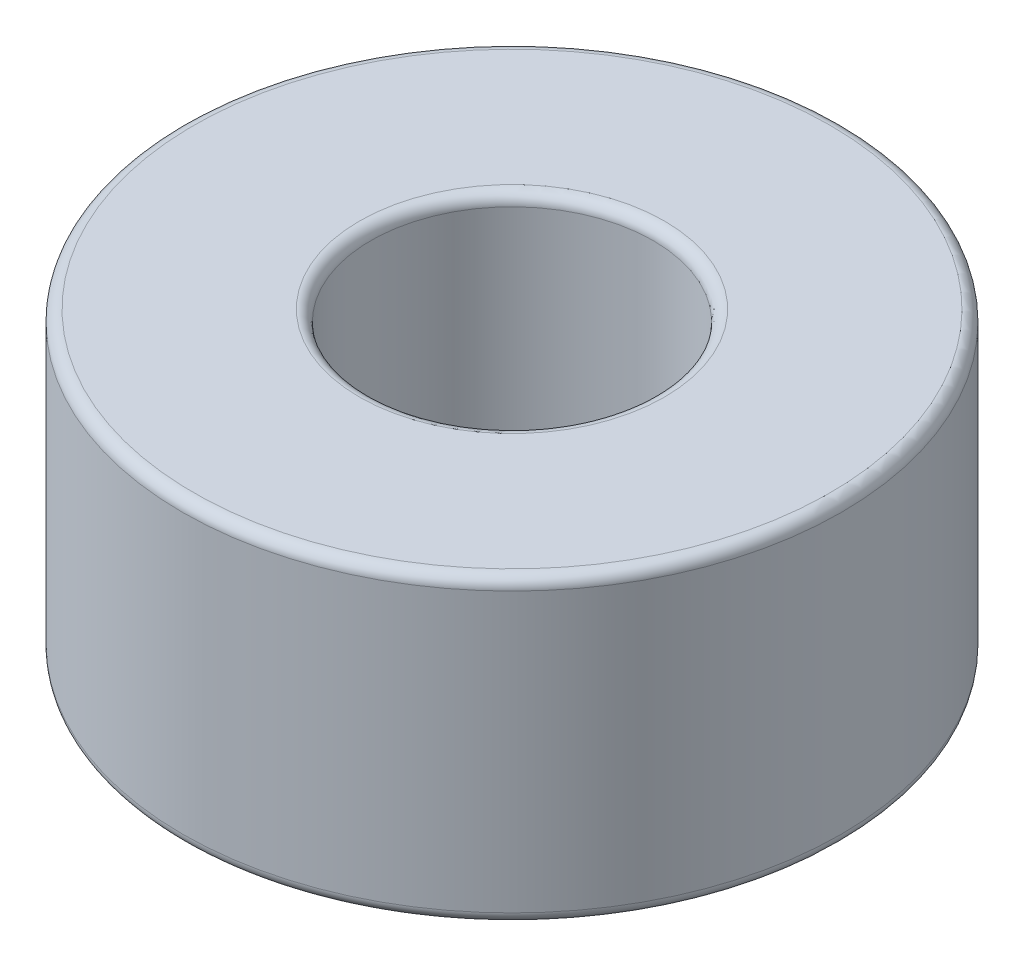
ISO-10303-21;
HEADER;
FILE_DESCRIPTION(('STEP AP214'),'2;1');
FILE_NAME('part.step','',(''),(''),'','','');
FILE_SCHEMA(('AUTOMOTIVE_DESIGN { 1 0 10303 214 1 1 1 1 }'));
ENDSEC;
DATA;
#1=APPLICATION_CONTEXT('core data for automotive mechanical design processes');
#2=APPLICATION_PROTOCOL_DEFINITION('international standard','automotive_design',2000,#1);
#3=PRODUCT_CONTEXT('',#1,'mechanical');
#4=PRODUCT('Part','Part','',(#3));
#5=PRODUCT_RELATED_PRODUCT_CATEGORY('part','',(#4));
#6=PRODUCT_DEFINITION_FORMATION('','',#4);
#7=PRODUCT_DEFINITION_CONTEXT('part definition',#1,'design');
#8=PRODUCT_DEFINITION('design','',#6,#7);
#9=PRODUCT_DEFINITION_SHAPE('','',#8);
#10=(LENGTH_UNIT() NAMED_UNIT(*) SI_UNIT(.MILLI.,.METRE.));
#11=(NAMED_UNIT(*) PLANE_ANGLE_UNIT() SI_UNIT($,.RADIAN.));
#12=(NAMED_UNIT(*) SI_UNIT($,.STERADIAN.) SOLID_ANGLE_UNIT());
#13=UNCERTAINTY_MEASURE_WITH_UNIT(LENGTH_MEASURE(1.E-05),#10,'distance_accuracy_value','');
#14=(GEOMETRIC_REPRESENTATION_CONTEXT(3) GLOBAL_UNCERTAINTY_ASSIGNED_CONTEXT((#13)) GLOBAL_UNIT_ASSIGNED_CONTEXT((#10,
#11,#12)) REPRESENTATION_CONTEXT('',''));
#15=CARTESIAN_POINT('',(0.,0.,0.));
#16=DIRECTION('',(0.,0.,1.));
#17=DIRECTION('',(1.,0.,0.));
#18=AXIS2_PLACEMENT_3D('',#15,#16,#17);
#19=CARTESIAN_POINT('',(0.,0.6,0.));
#20=DIRECTION('',(0.,-1.,0.));
#21=DIRECTION('',(0.,0.,-1.));
#22=AXIS2_PLACEMENT_3D('',#19,#20,#21);
#23=TOROIDAL_SURFACE('',#22,16.9,0.6);
#24=CARTESIAN_POINT('',(0.,0.,0.));
#25=DIRECTION('',(0.,-1.,0.));
#26=DIRECTION('',(0.,0.,-1.));
#27=AXIS2_PLACEMENT_3D('',#24,#25,#26);
#28=CIRCLE('',#27,16.9);
#29=CARTESIAN_POINT('',(0.,0.,-16.9));
#30=VERTEX_POINT('',#29);
#31=EDGE_CURVE('E10',#30,#30,#28,.T.);
#32=ORIENTED_EDGE('',*,*,#31,.F.);
#33=EDGE_LOOP('',(#32));
#34=FACE_BOUND('',#33,.T.);
#35=CARTESIAN_POINT('',(0.,0.600000000000004,0.));
#36=DIRECTION('',(0.,-1.,0.));
#37=DIRECTION('',(0.,0.,-1.));
#38=AXIS2_PLACEMENT_3D('',#35,#36,#37);
#39=CIRCLE('',#38,17.5);
#40=CARTESIAN_POINT('',(0.,0.600000000000004,-17.5));
#41=VERTEX_POINT('',#40);
#42=EDGE_CURVE('E59',#41,#41,#39,.T.);
#43=ORIENTED_EDGE('',*,*,#42,.T.);
#44=EDGE_LOOP('',(#43));
#45=FACE_BOUND('',#44,.T.);
#46=ADVANCED_FACE('F31',(#34,#45),#23,.T.);
#47=CARTESIAN_POINT('',(-16.9,0.,0.));
#48=DIRECTION('',(0.,1.,0.));
#49=DIRECTION('',(0.,0.,1.));
#50=AXIS2_PLACEMENT_3D('',#47,#48,#49);
#51=PLANE('',#50);
#52=CARTESIAN_POINT('',(0.,0.,0.));
#53=DIRECTION('',(0.,-1.,0.));
#54=DIRECTION('',(0.,0.,-1.));
#55=AXIS2_PLACEMENT_3D('',#52,#53,#54);
#56=CIRCLE('',#55,8.1);
#57=CARTESIAN_POINT('',(0.,0.,-8.1));
#58=VERTEX_POINT('',#57);
#59=EDGE_CURVE('E37',#58,#58,#56,.T.);
#60=ORIENTED_EDGE('',*,*,#59,.F.);
#61=EDGE_LOOP('',(#60));
#62=FACE_BOUND('',#61,.T.);
#63=ORIENTED_EDGE('',*,*,#31,.T.);
#64=EDGE_LOOP('',(#63));
#65=FACE_BOUND('',#64,.T.);
#66=ADVANCED_FACE('F96',(#62,#65),#51,.F.);
#67=CARTESIAN_POINT('',(0.,0.6,0.));
#68=DIRECTION('',(0.,-1.,0.));
#69=DIRECTION('',(0.,0.,-1.));
#70=AXIS2_PLACEMENT_3D('',#67,#68,#69);
#71=TOROIDAL_SURFACE('',#70,8.1,0.6);
#72=CARTESIAN_POINT('',(0.,0.600000000000004,0.));
#73=DIRECTION('',(0.,-1.,0.));
#74=DIRECTION('',(0.,0.,-1.));
#75=AXIS2_PLACEMENT_3D('',#72,#73,#74);
#76=CIRCLE('',#75,7.5);
#77=CARTESIAN_POINT('',(0.,0.600000000000004,-7.5));
#78=VERTEX_POINT('',#77);
#79=EDGE_CURVE('E41',#78,#78,#76,.T.);
#80=ORIENTED_EDGE('',*,*,#79,.F.);
#81=EDGE_LOOP('',(#80));
#82=FACE_BOUND('',#81,.T.);
#83=ORIENTED_EDGE('',*,*,#59,.T.);
#84=EDGE_LOOP('',(#83));
#85=FACE_BOUND('',#84,.T.);
#86=ADVANCED_FACE('F91',(#82,#85),#71,.T.);
#87=CARTESIAN_POINT('',(0.,0.,0.));
#88=DIRECTION('',(0.,-1.,0.));
#89=DIRECTION('',(0.,0.,-1.));
#90=AXIS2_PLACEMENT_3D('',#87,#88,#89);
#91=CYLINDRICAL_SURFACE('',#90,7.5);
#92=CARTESIAN_POINT('',(0.,15.4,0.));
#93=DIRECTION('',(0.,-1.,0.));
#94=DIRECTION('',(0.,0.,-1.));
#95=AXIS2_PLACEMENT_3D('',#92,#93,#94);
#96=CIRCLE('',#95,7.5);
#97=CARTESIAN_POINT('',(0.,15.4,-7.5));
#98=VERTEX_POINT('',#97);
#99=EDGE_CURVE('E45',#98,#98,#96,.T.);
#100=ORIENTED_EDGE('',*,*,#99,.F.);
#101=EDGE_LOOP('',(#100));
#102=FACE_BOUND('',#101,.T.);
#103=ORIENTED_EDGE('',*,*,#79,.T.);
#104=EDGE_LOOP('',(#103));
#105=FACE_BOUND('',#104,.T.);
#106=ADVANCED_FACE('F85',(#102,#105),#91,.F.);
#107=CARTESIAN_POINT('',(0.,15.4,0.));
#108=DIRECTION('',(0.,-1.,0.));
#109=DIRECTION('',(0.,0.,-1.));
#110=AXIS2_PLACEMENT_3D('',#107,#108,#109);
#111=TOROIDAL_SURFACE('',#110,8.1,0.6);
#112=CARTESIAN_POINT('',(0.,16.,0.));
#113=DIRECTION('',(0.,-1.,0.));
#114=DIRECTION('',(0.,0.,-1.));
#115=AXIS2_PLACEMENT_3D('',#112,#113,#114);
#116=CIRCLE('',#115,8.1);
#117=CARTESIAN_POINT('',(0.,16.,-8.1));
#118=VERTEX_POINT('',#117);
#119=EDGE_CURVE('E50',#118,#118,#116,.T.);
#120=ORIENTED_EDGE('',*,*,#119,.F.);
#121=EDGE_LOOP('',(#120));
#122=FACE_BOUND('',#121,.T.);
#123=ORIENTED_EDGE('',*,*,#99,.T.);
#124=EDGE_LOOP('',(#123));
#125=FACE_BOUND('',#124,.T.);
#126=ADVANCED_FACE('F79',(#122,#125),#111,.T.);
#127=CARTESIAN_POINT('',(-16.9,16.,0.));
#128=DIRECTION('',(0.,-1.,0.));
#129=DIRECTION('',(0.,0.,-1.));
#130=AXIS2_PLACEMENT_3D('',#127,#128,#129);
#131=PLANE('',#130);
#132=CARTESIAN_POINT('',(0.,16.,0.));
#133=DIRECTION('',(0.,-1.,0.));
#134=DIRECTION('',(0.,0.,-1.));
#135=AXIS2_PLACEMENT_3D('',#132,#133,#134);
#136=CIRCLE('',#135,16.9);
#137=CARTESIAN_POINT('',(0.,16.,-16.9));
#138=VERTEX_POINT('',#137);
#139=EDGE_CURVE('E53',#138,#138,#136,.T.);
#140=ORIENTED_EDGE('',*,*,#139,.F.);
#141=EDGE_LOOP('',(#140));
#142=FACE_BOUND('',#141,.T.);
#143=ORIENTED_EDGE('',*,*,#119,.T.);
#144=EDGE_LOOP('',(#143));
#145=FACE_BOUND('',#144,.T.);
#146=ADVANCED_FACE('F73',(#142,#145),#131,.F.);
#147=CARTESIAN_POINT('',(0.,15.4,0.));
#148=DIRECTION('',(0.,-1.,0.));
#149=DIRECTION('',(0.,0.,-1.));
#150=AXIS2_PLACEMENT_3D('',#147,#148,#149);
#151=TOROIDAL_SURFACE('',#150,16.9,0.6);
#152=CARTESIAN_POINT('',(0.,15.4,0.));
#153=DIRECTION('',(0.,-1.,0.));
#154=DIRECTION('',(0.,0.,-1.));
#155=AXIS2_PLACEMENT_3D('',#152,#153,#154);
#156=CIRCLE('',#155,17.5);
#157=CARTESIAN_POINT('',(0.,15.4,-17.5));
#158=VERTEX_POINT('',#157);
#159=EDGE_CURVE('E56',#158,#158,#156,.T.);
#160=ORIENTED_EDGE('',*,*,#159,.F.);
#161=EDGE_LOOP('',(#160));
#162=FACE_BOUND('',#161,.T.);
#163=ORIENTED_EDGE('',*,*,#139,.T.);
#164=EDGE_LOOP('',(#163));
#165=FACE_BOUND('',#164,.T.);
#166=ADVANCED_FACE('F67',(#162,#165),#151,.T.);
#167=CARTESIAN_POINT('',(0.,0.,0.));
#168=DIRECTION('',(0.,-1.,0.));
#169=DIRECTION('',(0.,0.,-1.));
#170=AXIS2_PLACEMENT_3D('',#167,#168,#169);
#171=CYLINDRICAL_SURFACE('',#170,17.5);
#172=ORIENTED_EDGE('',*,*,#42,.F.);
#173=EDGE_LOOP('',(#172));
#174=FACE_BOUND('',#173,.T.);
#175=ORIENTED_EDGE('',*,*,#159,.T.);
#176=EDGE_LOOP('',(#175));
#177=FACE_BOUND('',#176,.T.);
#178=ADVANCED_FACE('F64',(#174,#177),#171,.T.);
#179=CLOSED_SHELL('',(#46,#66,#86,#106,#126,#146,#166,#178));
#180=MANIFOLD_SOLID_BREP('B2',#179);
#181=ADVANCED_BREP_SHAPE_REPRESENTATION('',(#18,#180),#14);
#182=SHAPE_DEFINITION_REPRESENTATION(#9,#181);
ENDSEC;
END-ISO-10303-21;
